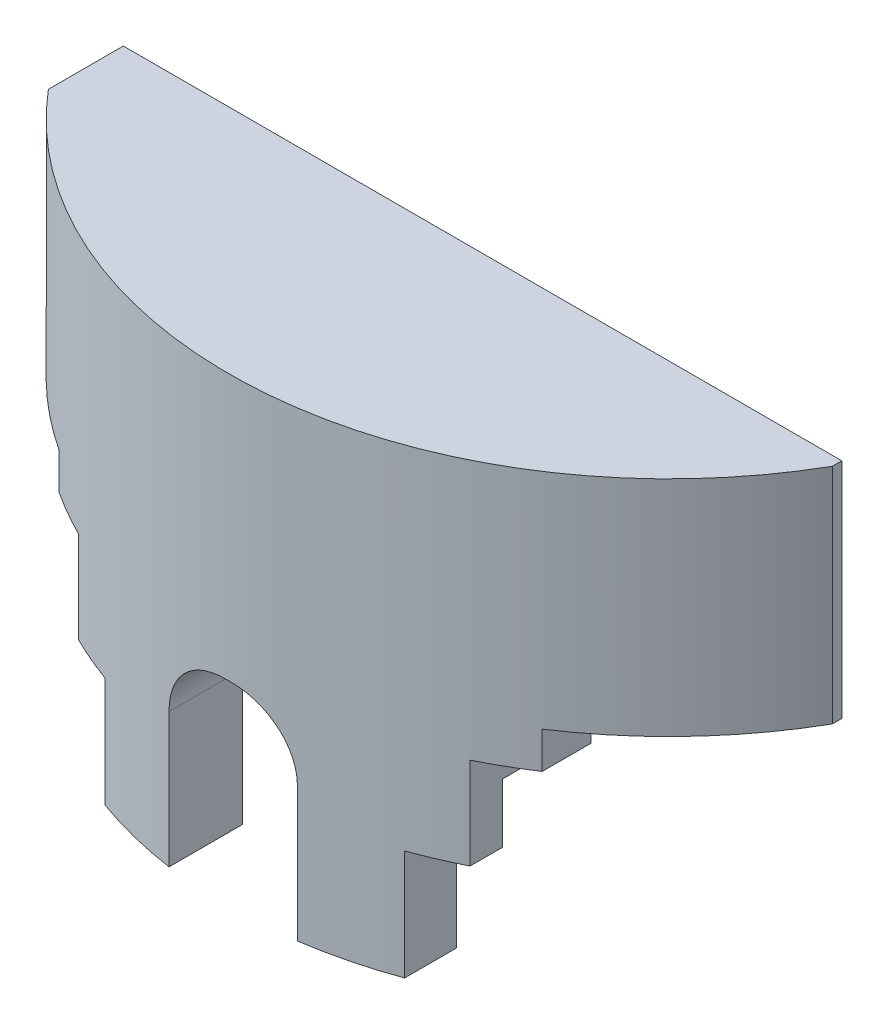
ISO-10303-21;
HEADER;
FILE_DESCRIPTION(('STEP AP214'),'2;1');
FILE_NAME('part.step','',(''),(''),'','','');
FILE_SCHEMA(('AUTOMOTIVE_DESIGN { 1 0 10303 214 1 1 1 1 }'));
ENDSEC;
DATA;
#1=APPLICATION_CONTEXT('core data for automotive mechanical design processes');
#2=APPLICATION_PROTOCOL_DEFINITION('international standard','automotive_design',2000,#1);
#3=PRODUCT_CONTEXT('',#1,'mechanical');
#4=PRODUCT('Part','Part','',(#3));
#5=PRODUCT_RELATED_PRODUCT_CATEGORY('part','',(#4));
#6=PRODUCT_DEFINITION_FORMATION('','',#4);
#7=PRODUCT_DEFINITION_CONTEXT('part definition',#1,'design');
#8=PRODUCT_DEFINITION('design','',#6,#7);
#9=PRODUCT_DEFINITION_SHAPE('','',#8);
#10=(LENGTH_UNIT() NAMED_UNIT(*) SI_UNIT(.MILLI.,.METRE.));
#11=(NAMED_UNIT(*) PLANE_ANGLE_UNIT() SI_UNIT($,.RADIAN.));
#12=(NAMED_UNIT(*) SI_UNIT($,.STERADIAN.) SOLID_ANGLE_UNIT());
#13=UNCERTAINTY_MEASURE_WITH_UNIT(LENGTH_MEASURE(1.E-05),#10,'distance_accuracy_value','');
#14=(GEOMETRIC_REPRESENTATION_CONTEXT(3) GLOBAL_UNCERTAINTY_ASSIGNED_CONTEXT((#13)) GLOBAL_UNIT_ASSIGNED_CONTEXT((#10,
#11,#12)) REPRESENTATION_CONTEXT('',''));
#15=CARTESIAN_POINT('',(0.,0.,0.));
#16=DIRECTION('',(0.,0.,1.));
#17=DIRECTION('',(1.,0.,0.));
#18=AXIS2_PLACEMENT_3D('',#15,#16,#17);
#19=CARTESIAN_POINT('',(0.,-42.5,0.));
#20=DIRECTION('',(0.,-1.,0.));
#21=DIRECTION('',(0.,0.,-1.));
#22=AXIS2_PLACEMENT_3D('',#19,#20,#21);
#23=PLANE('',#22);
#24=DIRECTION('',(0.,0.,1.));
#25=VECTOR('',#24,1.);
#26=CARTESIAN_POINT('',(32.,-42.5,34.2));
#27=LINE('',#26,#25);
#28=CARTESIAN_POINT('',(32.,-42.5,52.2));
#29=VERTEX_POINT('',#28);
#30=CARTESIAN_POINT('',(32.,-42.5,64.4980619863884));
#31=VERTEX_POINT('',#30);
#32=EDGE_CURVE('E382',#29,#31,#27,.T.);
#33=ORIENTED_EDGE('',*,*,#32,.F.);
#34=DIRECTION('',(1.,0.,0.));
#35=VECTOR('',#34,1.);
#36=CARTESIAN_POINT('',(0.,-42.5,52.2));
#37=LINE('',#36,#35);
#38=CARTESIAN_POINT('',(39.5,-42.5,52.2));
#39=VERTEX_POINT('',#38);
#40=EDGE_CURVE('E480',#29,#39,#37,.T.);
#41=ORIENTED_EDGE('',*,*,#40,.T.);
#42=DIRECTION('',(0.,0.,1.));
#43=VECTOR('',#42,1.);
#44=CARTESIAN_POINT('',(39.5,-42.5,0.));
#45=LINE('',#44,#43);
#46=CARTESIAN_POINT('',(39.5,-42.5,60.1975913139388));
#47=VERTEX_POINT('',#46);
#48=EDGE_CURVE('E371',#39,#47,#45,.T.);
#49=ORIENTED_EDGE('',*,*,#48,.T.);
#50=CARTESIAN_POINT('',(0.,-42.5,0.));
#51=DIRECTION('',(0.,-1.,0.));
#52=DIRECTION('',(0.,0.,-1.));
#53=AXIS2_PLACEMENT_3D('',#50,#51,#52);
#54=CIRCLE('',#53,72.);
#55=EDGE_CURVE('E360',#47,#31,#54,.T.);
#56=ORIENTED_EDGE('',*,*,#55,.T.);
#57=EDGE_LOOP('',(#33,#41,#49,#56));
#58=FACE_BOUND('',#57,.T.);
#59=ADVANCED_FACE('F36',(#58),#23,.T.);
#60=CARTESIAN_POINT('',(39.5,-42.5,0.));
#61=DIRECTION('',(-1.,0.,0.));
#62=DIRECTION('',(0.,0.,1.));
#63=AXIS2_PLACEMENT_3D('',#60,#61,#62);
#64=PLANE('',#63);
#65=ORIENTED_EDGE('',*,*,#48,.F.);
#66=DIRECTION('',(0.,-1.,0.));
#67=VECTOR('',#66,1.);
#68=CARTESIAN_POINT('',(39.5,-42.5,52.2));
#69=LINE('',#68,#67);
#70=CARTESIAN_POINT('',(39.5,-36.5,52.2));
#71=VERTEX_POINT('',#70);
#72=EDGE_CURVE('E452',#71,#39,#69,.T.);
#73=ORIENTED_EDGE('',*,*,#72,.F.);
#74=DIRECTION('',(0.,0.,1.));
#75=VECTOR('',#74,1.);
#76=CARTESIAN_POINT('',(39.5,-36.5,0.));
#77=LINE('',#76,#75);
#78=CARTESIAN_POINT('',(39.5,-36.5,60.1975913139388));
#79=VERTEX_POINT('',#78);
#80=EDGE_CURVE('E366',#71,#79,#77,.T.);
#81=ORIENTED_EDGE('',*,*,#80,.T.);
#82=DIRECTION('',(0.,1.,0.));
#83=VECTOR('',#82,1.);
#84=CARTESIAN_POINT('',(39.5,-42.5,60.1975913139388));
#85=LINE('',#84,#83);
#86=EDGE_CURVE('E252',#47,#79,#85,.T.);
#87=ORIENTED_EDGE('',*,*,#86,.F.);
#88=EDGE_LOOP('',(#65,#73,#81,#87));
#89=FACE_BOUND('',#88,.T.);
#90=ADVANCED_FACE('F325',(#89),#64,.F.);
#91=CARTESIAN_POINT('',(-39.5,-42.5,0.));
#92=DIRECTION('',(1.,0.,0.));
#93=DIRECTION('',(0.,0.,-1.));
#94=AXIS2_PLACEMENT_3D('',#91,#92,#93);
#95=PLANE('',#94);
#96=DIRECTION('',(0.,1.,0.));
#97=VECTOR('',#96,1.);
#98=CARTESIAN_POINT('',(-39.5,-42.5,52.2));
#99=LINE('',#98,#97);
#100=CARTESIAN_POINT('',(-39.5,-42.5,52.2));
#101=VERTEX_POINT('',#100);
#102=CARTESIAN_POINT('',(-39.5,-36.5,52.2));
#103=VERTEX_POINT('',#102);
#104=EDGE_CURVE('E456',#101,#103,#99,.T.);
#105=ORIENTED_EDGE('',*,*,#104,.F.);
#106=DIRECTION('',(0.,0.,-1.));
#107=VECTOR('',#106,1.);
#108=CARTESIAN_POINT('',(-39.5,-42.5,0.));
#109=LINE('',#108,#107);
#110=CARTESIAN_POINT('',(-39.5,-42.5,60.1975913139388));
#111=VERTEX_POINT('',#110);
#112=EDGE_CURVE('E351',#111,#101,#109,.T.);
#113=ORIENTED_EDGE('',*,*,#112,.F.);
#114=DIRECTION('',(0.,1.,0.));
#115=VECTOR('',#114,1.);
#116=CARTESIAN_POINT('',(-39.5,-42.5,60.1975913139388));
#117=LINE('',#116,#115);
#118=CARTESIAN_POINT('',(-39.5,-36.5,60.1975913139388));
#119=VERTEX_POINT('',#118);
#120=EDGE_CURVE('E359',#111,#119,#117,.T.);
#121=ORIENTED_EDGE('',*,*,#120,.T.);
#122=DIRECTION('',(0.,0.,-1.));
#123=VECTOR('',#122,1.);
#124=CARTESIAN_POINT('',(-39.5,-36.5,0.));
#125=LINE('',#124,#123);
#126=EDGE_CURVE('E368',#119,#103,#125,.T.);
#127=ORIENTED_EDGE('',*,*,#126,.T.);
#128=EDGE_LOOP('',(#105,#113,#121,#127));
#129=FACE_BOUND('',#128,.T.);
#130=ADVANCED_FACE('F332',(#129),#95,.F.);
#131=ORIENTED_EDGE('',*,*,#112,.T.);
#132=DIRECTION('',(1.,0.,0.));
#133=VECTOR('',#132,1.);
#134=CARTESIAN_POINT('',(0.,-42.5,52.2));
#135=LINE('',#134,#133);
#136=CARTESIAN_POINT('',(-32.,-42.5,52.2));
#137=VERTEX_POINT('',#136);
#138=EDGE_CURVE('E353',#101,#137,#135,.T.);
#139=ORIENTED_EDGE('',*,*,#138,.T.);
#140=DIRECTION('',(0.,0.,-1.));
#141=VECTOR('',#140,1.);
#142=CARTESIAN_POINT('',(-32.,-42.5,64.4980619863884));
#143=LINE('',#142,#141);
#144=CARTESIAN_POINT('',(-32.,-42.5,64.4980619863884));
#145=VERTEX_POINT('',#144);
#146=EDGE_CURVE('E385',#145,#137,#143,.T.);
#147=ORIENTED_EDGE('',*,*,#146,.F.);
#148=EDGE_CURVE('E356',#145,#111,#54,.T.);
#149=ORIENTED_EDGE('',*,*,#148,.T.);
#150=EDGE_LOOP('',(#131,#139,#147,#149));
#151=FACE_BOUND('',#150,.T.);
#152=ADVANCED_FACE('F328',(#151),#23,.T.);
#153=CARTESIAN_POINT('',(-32.,-57.5,64.4980619863884));
#154=DIRECTION('',(1.,0.,0.));
#155=DIRECTION('',(0.,0.,-1.));
#156=AXIS2_PLACEMENT_3D('',#153,#154,#155);
#157=PLANE('',#156);
#158=DIRECTION('',(0.,1.,0.));
#159=VECTOR('',#158,1.);
#160=CARTESIAN_POINT('',(-32.,-57.5,52.2));
#161=LINE('',#160,#159);
#162=CARTESIAN_POINT('',(-32.,-47.8210916541997,52.2));
#163=VERTEX_POINT('',#162);
#164=EDGE_CURVE('E483',#163,#137,#161,.T.);
#165=ORIENTED_EDGE('',*,*,#164,.F.);
#166=DIRECTION('',(0.,0.,-1.));
#167=VECTOR('',#166,1.);
#168=CARTESIAN_POINT('',(-32.,-47.8210916541997,59.2));
#169=LINE('',#168,#167);
#170=CARTESIAN_POINT('',(-32.,-47.8210916541997,59.2));
#171=VERTEX_POINT('',#170);
#172=EDGE_CURVE('E407',#163,#171,#169,.F.);
#173=ORIENTED_EDGE('',*,*,#172,.T.);
#174=DIRECTION('',(0.,1.,0.));
#175=VECTOR('',#174,1.);
#176=CARTESIAN_POINT('',(-32.,-57.5,59.2));
#177=LINE('',#176,#175);
#178=CARTESIAN_POINT('',(-32.,-57.5,59.2));
#179=VERTEX_POINT('',#178);
#180=EDGE_CURVE('E416',#179,#171,#177,.T.);
#181=ORIENTED_EDGE('',*,*,#180,.F.);
#182=DIRECTION('',(0.,0.,-1.));
#183=VECTOR('',#182,1.);
#184=CARTESIAN_POINT('',(-32.,-57.5,64.4980619863884));
#185=LINE('',#184,#183);
#186=CARTESIAN_POINT('',(-32.,-57.5,64.4980619863884));
#187=VERTEX_POINT('',#186);
#188=EDGE_CURVE('E389',#187,#179,#185,.T.);
#189=ORIENTED_EDGE('',*,*,#188,.F.);
#190=DIRECTION('',(0.,1.,0.));
#191=VECTOR('',#190,1.);
#192=CARTESIAN_POINT('',(-32.,-57.5,64.4980619863884));
#193=LINE('',#192,#191);
#194=EDGE_CURVE('E369',#187,#145,#193,.T.);
#195=ORIENTED_EDGE('',*,*,#194,.T.);
#196=ORIENTED_EDGE('',*,*,#146,.T.);
#197=EDGE_LOOP('',(#165,#173,#181,#189,#195,#196));
#198=FACE_BOUND('',#197,.T.);
#199=ADVANCED_FACE('F339',(#198),#157,.F.);
#200=CARTESIAN_POINT('',(32.,-57.5,34.2));
#201=DIRECTION('',(-1.,0.,0.));
#202=DIRECTION('',(0.,0.,1.));
#203=AXIS2_PLACEMENT_3D('',#200,#201,#202);
#204=PLANE('',#203);
#205=DIRECTION('',(0.,-1.,0.));
#206=VECTOR('',#205,1.);
#207=CARTESIAN_POINT('',(32.,-57.5,52.2));
#208=LINE('',#207,#206);
#209=CARTESIAN_POINT('',(32.,-47.8210916541997,52.2));
#210=VERTEX_POINT('',#209);
#211=EDGE_CURVE('E471',#29,#210,#208,.T.);
#212=ORIENTED_EDGE('',*,*,#211,.F.);
#213=ORIENTED_EDGE('',*,*,#32,.T.);
#214=DIRECTION('',(0.,1.,0.));
#215=VECTOR('',#214,1.);
#216=CARTESIAN_POINT('',(32.,-57.5,64.4980619863884));
#217=LINE('',#216,#215);
#218=CARTESIAN_POINT('',(32.,-57.5,64.4980619863884));
#219=VERTEX_POINT('',#218);
#220=EDGE_CURVE('E378',#219,#31,#217,.T.);
#221=ORIENTED_EDGE('',*,*,#220,.F.);
#222=DIRECTION('',(0.,0.,1.));
#223=VECTOR('',#222,1.);
#224=CARTESIAN_POINT('',(32.,-57.5,34.2));
#225=LINE('',#224,#223);
#226=CARTESIAN_POINT('',(32.,-57.5,59.2));
#227=VERTEX_POINT('',#226);
#228=EDGE_CURVE('E381',#227,#219,#225,.T.);
#229=ORIENTED_EDGE('',*,*,#228,.F.);
#230=DIRECTION('',(0.,-1.,0.));
#231=VECTOR('',#230,1.);
#232=CARTESIAN_POINT('',(32.,-57.5,59.2));
#233=LINE('',#232,#231);
#234=CARTESIAN_POINT('',(32.,-47.8210916541997,59.2));
#235=VERTEX_POINT('',#234);
#236=EDGE_CURVE('E422',#235,#227,#233,.T.);
#237=ORIENTED_EDGE('',*,*,#236,.F.);
#238=DIRECTION('',(0.,0.,-1.));
#239=VECTOR('',#238,1.);
#240=CARTESIAN_POINT('',(32.,-47.8210916541997,59.2));
#241=LINE('',#240,#239);
#242=EDGE_CURVE('E270',#235,#210,#241,.T.);
#243=ORIENTED_EDGE('',*,*,#242,.T.);
#244=EDGE_LOOP('',(#212,#213,#221,#229,#237,#243));
#245=FACE_BOUND('',#244,.T.);
#246=ADVANCED_FACE('F345',(#245),#204,.F.);
#247=CARTESIAN_POINT('',(0.,-53.5,59.2));
#248=DIRECTION('',(0.,0.,-1.));
#249=DIRECTION('',(-1.,0.,0.));
#250=AXIS2_PLACEMENT_3D('',#247,#248,#249);
#251=CYLINDRICAL_SURFACE('',#250,32.5);
#252=CARTESIAN_POINT('',(0.,-53.5,52.2));
#253=DIRECTION('',(0.,0.,-1.));
#254=DIRECTION('',(-1.,0.,0.));
#255=AXIS2_PLACEMENT_3D('',#252,#253,#254);
#256=CIRCLE('',#255,32.5);
#257=EDGE_CURVE('E45',#210,#163,#256,.F.);
#258=ORIENTED_EDGE('',*,*,#257,.F.);
#259=ORIENTED_EDGE('',*,*,#242,.F.);
#260=CARTESIAN_POINT('',(0.,-53.5,59.2));
#261=DIRECTION('',(0.,0.,-1.));
#262=DIRECTION('',(-1.,0.,0.));
#263=AXIS2_PLACEMENT_3D('',#260,#261,#262);
#264=CIRCLE('',#263,32.5);
#265=EDGE_CURVE('E431',#171,#235,#264,.T.);
#266=ORIENTED_EDGE('',*,*,#265,.F.);
#267=ORIENTED_EDGE('',*,*,#172,.F.);
#268=EDGE_LOOP('',(#258,#259,#266,#267));
#269=FACE_BOUND('',#268,.T.);
#270=ADVANCED_FACE('F492',(#269),#251,.F.);
#271=CARTESIAN_POINT('',(0.,-75.5,0.));
#272=DIRECTION('',(0.,1.,0.));
#273=DIRECTION('',(0.,0.,1.));
#274=AXIS2_PLACEMENT_3D('',#271,#272,#273);
#275=PLANE('',#274);
#276=DIRECTION('',(-1.,0.,0.));
#277=VECTOR('',#276,1.);
#278=CARTESIAN_POINT('',(0.,-75.5,59.2));
#279=LINE('',#278,#277);
#280=CARTESIAN_POINT('',(-10.5,-75.5,59.2));
#281=VERTEX_POINT('',#280);
#282=CARTESIAN_POINT('',(-24.5,-75.5,59.2));
#283=VERTEX_POINT('',#282);
#284=EDGE_CURVE('E264',#281,#283,#279,.T.);
#285=ORIENTED_EDGE('',*,*,#284,.F.);
#286=DIRECTION('',(0.,0.,-1.));
#287=VECTOR('',#286,1.);
#288=CARTESIAN_POINT('',(-10.5,-75.5,34.2));
#289=LINE('',#288,#287);
#290=CARTESIAN_POINT('',(-10.5,-75.5,71.2302604235026));
#291=VERTEX_POINT('',#290);
#292=EDGE_CURVE('E443',#291,#281,#289,.T.);
#293=ORIENTED_EDGE('',*,*,#292,.F.);
#294=CARTESIAN_POINT('',(0.,-75.5,0.));
#295=DIRECTION('',(0.,-1.,0.));
#296=DIRECTION('',(0.,0.,1.));
#297=AXIS2_PLACEMENT_3D('',#294,#295,#296);
#298=CIRCLE('',#297,72.);
#299=CARTESIAN_POINT('',(-24.5,-75.5,67.7033972559723));
#300=VERTEX_POINT('',#299);
#301=EDGE_CURVE('E413',#291,#300,#298,.T.);
#302=ORIENTED_EDGE('',*,*,#301,.T.);
#303=DIRECTION('',(0.,0.,-1.));
#304=VECTOR('',#303,1.);
#305=CARTESIAN_POINT('',(-24.5,-75.5,34.2));
#306=LINE('',#305,#304);
#307=EDGE_CURVE('E400',#300,#283,#306,.T.);
#308=ORIENTED_EDGE('',*,*,#307,.T.);
#309=EDGE_LOOP('',(#285,#293,#302,#308));
#310=FACE_BOUND('',#309,.T.);
#311=ADVANCED_FACE('F541',(#310),#275,.F.);
#312=CARTESIAN_POINT('',(0.,-57.5,0.));
#313=DIRECTION('',(0.,-1.,0.));
#314=DIRECTION('',(0.,0.,-1.));
#315=AXIS2_PLACEMENT_3D('',#312,#313,#314);
#316=PLANE('',#315);
#317=ORIENTED_EDGE('',*,*,#188,.T.);
#318=DIRECTION('',(1.,0.,0.));
#319=VECTOR('',#318,1.);
#320=CARTESIAN_POINT('',(0.,-57.5,59.2));
#321=LINE('',#320,#319);
#322=CARTESIAN_POINT('',(-24.5,-57.5,59.2));
#323=VERTEX_POINT('',#322);
#324=EDGE_CURVE('E419',#179,#323,#321,.T.);
#325=ORIENTED_EDGE('',*,*,#324,.T.);
#326=DIRECTION('',(0.,0.,-1.));
#327=VECTOR('',#326,1.);
#328=CARTESIAN_POINT('',(-24.5,-57.5,34.2));
#329=LINE('',#328,#327);
#330=CARTESIAN_POINT('',(-24.5,-57.5,67.7033972559723));
#331=VERTEX_POINT('',#330);
#332=EDGE_CURVE('E401',#331,#323,#329,.T.);
#333=ORIENTED_EDGE('',*,*,#332,.F.);
#334=CARTESIAN_POINT('',(0.,-57.5,0.));
#335=DIRECTION('',(0.,-1.,0.));
#336=DIRECTION('',(0.,0.,-1.));
#337=AXIS2_PLACEMENT_3D('',#334,#335,#336);
#338=CIRCLE('',#337,72.);
#339=EDGE_CURVE('E384',#331,#187,#338,.T.);
#340=ORIENTED_EDGE('',*,*,#339,.T.);
#341=EDGE_LOOP('',(#317,#325,#333,#340));
#342=FACE_BOUND('',#341,.T.);
#343=ADVANCED_FACE('F550',(#342),#316,.T.);
#344=DIRECTION('',(0.,0.,1.));
#345=VECTOR('',#344,1.);
#346=CARTESIAN_POINT('',(24.5,-57.5,34.2));
#347=LINE('',#346,#345);
#348=CARTESIAN_POINT('',(24.5,-57.5,59.2));
#349=VERTEX_POINT('',#348);
#350=CARTESIAN_POINT('',(24.5,-57.5,67.7033972559723));
#351=VERTEX_POINT('',#350);
#352=EDGE_CURVE('E405',#349,#351,#347,.T.);
#353=ORIENTED_EDGE('',*,*,#352,.F.);
#354=DIRECTION('',(1.,0.,0.));
#355=VECTOR('',#354,1.);
#356=CARTESIAN_POINT('',(0.,-57.5,59.2));
#357=LINE('',#356,#355);
#358=EDGE_CURVE('E424',#349,#227,#357,.T.);
#359=ORIENTED_EDGE('',*,*,#358,.T.);
#360=ORIENTED_EDGE('',*,*,#228,.T.);
#361=EDGE_CURVE('E392',#219,#351,#338,.T.);
#362=ORIENTED_EDGE('',*,*,#361,.T.);
#363=EDGE_LOOP('',(#353,#359,#360,#362));
#364=FACE_BOUND('',#363,.T.);
#365=ADVANCED_FACE('F504',(#364),#316,.T.);
#366=CARTESIAN_POINT('',(24.5,-75.5,34.2));
#367=DIRECTION('',(-1.,0.,0.));
#368=DIRECTION('',(0.,0.,1.));
#369=AXIS2_PLACEMENT_3D('',#366,#367,#368);
#370=PLANE('',#369);
#371=DIRECTION('',(0.,-1.,0.));
#372=VECTOR('',#371,1.);
#373=CARTESIAN_POINT('',(24.5,-75.5,59.2));
#374=LINE('',#373,#372);
#375=CARTESIAN_POINT('',(24.5,-75.5,59.2));
#376=VERTEX_POINT('',#375);
#377=EDGE_CURVE('E427',#349,#376,#374,.T.);
#378=ORIENTED_EDGE('',*,*,#377,.F.);
#379=ORIENTED_EDGE('',*,*,#352,.T.);
#380=DIRECTION('',(0.,1.,0.));
#381=VECTOR('',#380,1.);
#382=CARTESIAN_POINT('',(24.5,-75.5,67.7033972559723));
#383=LINE('',#382,#381);
#384=CARTESIAN_POINT('',(24.5,-75.5,67.7033972559723));
#385=VERTEX_POINT('',#384);
#386=EDGE_CURVE('E387',#385,#351,#383,.T.);
#387=ORIENTED_EDGE('',*,*,#386,.F.);
#388=DIRECTION('',(0.,0.,1.));
#389=VECTOR('',#388,1.);
#390=CARTESIAN_POINT('',(24.5,-75.5,34.2));
#391=LINE('',#390,#389);
#392=EDGE_CURVE('E404',#376,#385,#391,.T.);
#393=ORIENTED_EDGE('',*,*,#392,.F.);
#394=EDGE_LOOP('',(#378,#379,#387,#393));
#395=FACE_BOUND('',#394,.T.);
#396=ADVANCED_FACE('F509',(#395),#370,.F.);
#397=CARTESIAN_POINT('',(-24.5,-75.5,34.2));
#398=DIRECTION('',(1.,0.,0.));
#399=DIRECTION('',(0.,0.,-1.));
#400=AXIS2_PLACEMENT_3D('',#397,#398,#399);
#401=PLANE('',#400);
#402=DIRECTION('',(0.,1.,0.));
#403=VECTOR('',#402,1.);
#404=CARTESIAN_POINT('',(-24.5,-75.5,59.2));
#405=LINE('',#404,#403);
#406=EDGE_CURVE('E429',#283,#323,#405,.T.);
#407=ORIENTED_EDGE('',*,*,#406,.F.);
#408=ORIENTED_EDGE('',*,*,#307,.F.);
#409=DIRECTION('',(0.,1.,0.));
#410=VECTOR('',#409,1.);
#411=CARTESIAN_POINT('',(-24.5,-75.5,67.7033972559723));
#412=LINE('',#411,#410);
#413=EDGE_CURVE('E397',#300,#331,#412,.T.);
#414=ORIENTED_EDGE('',*,*,#413,.T.);
#415=ORIENTED_EDGE('',*,*,#332,.T.);
#416=EDGE_LOOP('',(#407,#408,#414,#415));
#417=FACE_BOUND('',#416,.T.);
#418=ADVANCED_FACE('F544',(#417),#401,.F.);
#419=CARTESIAN_POINT('',(10.5,-75.5,71.2302604235026));
#420=VERTEX_POINT('',#419);
#421=EDGE_CURVE('E410',#385,#420,#298,.T.);
#422=ORIENTED_EDGE('',*,*,#421,.T.);
#423=DIRECTION('',(0.,0.,1.));
#424=VECTOR('',#423,1.);
#425=CARTESIAN_POINT('',(10.5,-75.5,34.2));
#426=LINE('',#425,#424);
#427=CARTESIAN_POINT('',(10.5,-75.5,59.2));
#428=VERTEX_POINT('',#427);
#429=EDGE_CURVE('E441',#428,#420,#426,.T.);
#430=ORIENTED_EDGE('',*,*,#429,.F.);
#431=EDGE_CURVE('E267',#376,#428,#279,.T.);
#432=ORIENTED_EDGE('',*,*,#431,.F.);
#433=ORIENTED_EDGE('',*,*,#392,.T.);
#434=EDGE_LOOP('',(#422,#430,#432,#433));
#435=FACE_BOUND('',#434,.T.);
#436=ADVANCED_FACE('F513',(#435),#275,.F.);
#437=CARTESIAN_POINT('',(0.,-36.5,0.));
#438=DIRECTION('',(0.,1.,0.));
#439=DIRECTION('',(0.,0.,1.));
#440=AXIS2_PLACEMENT_3D('',#437,#438,#439);
#441=PLANE('',#440);
#442=CARTESIAN_POINT('',(0.,-36.5,0.));
#443=DIRECTION('',(0.,1.,0.));
#444=DIRECTION('',(0.,0.,1.));
#445=AXIS2_PLACEMENT_3D('',#442,#443,#444);
#446=CIRCLE('',#445,72.);
#447=CARTESIAN_POINT('',(-55.,-36.5,46.4650406219558));
#448=VERTEX_POINT('',#447);
#449=EDGE_CURVE('E236',#448,#119,#446,.T.);
#450=ORIENTED_EDGE('',*,*,#449,.F.);
#451=DIRECTION('',(0.,0.,-1.));
#452=VECTOR('',#451,1.);
#453=CARTESIAN_POINT('',(-55.,-36.5,72.));
#454=LINE('',#453,#452);
#455=CARTESIAN_POINT('',(-55.,-36.5,34.2));
#456=VERTEX_POINT('',#455);
#457=EDGE_CURVE('E223',#448,#456,#454,.T.);
#458=ORIENTED_EDGE('',*,*,#457,.T.);
#459=DIRECTION('',(-1.,0.,0.));
#460=VECTOR('',#459,1.);
#461=CARTESIAN_POINT('',(-62.5,-36.5,34.2));
#462=LINE('',#461,#460);
#463=CARTESIAN_POINT('',(-40.7749773139559,-36.5,34.2));
#464=VERTEX_POINT('',#463);
#465=EDGE_CURVE('E234',#464,#456,#462,.T.);
#466=ORIENTED_EDGE('',*,*,#465,.F.);
#467=DIRECTION('',(0.,0.,-1.));
#468=VECTOR('',#467,1.);
#469=CARTESIAN_POINT('',(-40.7749773139559,-36.5,52.2));
#470=LINE('',#469,#468);
#471=CARTESIAN_POINT('',(-40.7749773139559,-36.5,52.2));
#472=VERTEX_POINT('',#471);
#473=EDGE_CURVE('E448',#464,#472,#470,.F.);
#474=ORIENTED_EDGE('',*,*,#473,.T.);
#475=DIRECTION('',(-1.,0.,0.));
#476=VECTOR('',#475,1.);
#477=CARTESIAN_POINT('',(0.,-36.5,52.2));
#478=LINE('',#477,#476);
#479=EDGE_CURVE('E454',#103,#472,#478,.T.);
#480=ORIENTED_EDGE('',*,*,#479,.F.);
#481=ORIENTED_EDGE('',*,*,#126,.F.);
#482=EDGE_LOOP('',(#450,#458,#466,#474,#480,#481));
#483=FACE_BOUND('',#482,.T.);
#484=ADVANCED_FACE('F232',(#483),#441,.F.);
#485=DIRECTION('',(-1.,0.,0.));
#486=VECTOR('',#485,1.);
#487=CARTESIAN_POINT('',(0.,-36.5,52.2));
#488=LINE('',#487,#486);
#489=CARTESIAN_POINT('',(40.7749773139559,-36.5,52.2));
#490=VERTEX_POINT('',#489);
#491=EDGE_CURVE('E450',#490,#71,#488,.T.);
#492=ORIENTED_EDGE('',*,*,#491,.F.);
#493=DIRECTION('',(0.,0.,-1.));
#494=VECTOR('',#493,1.);
#495=CARTESIAN_POINT('',(40.7749773139559,-36.5,52.2));
#496=LINE('',#495,#494);
#497=CARTESIAN_POINT('',(40.7749773139559,-36.5,34.2));
#498=VERTEX_POINT('',#497);
#499=EDGE_CURVE('E445',#490,#498,#496,.T.);
#500=ORIENTED_EDGE('',*,*,#499,.T.);
#501=CARTESIAN_POINT('',(62.5,-36.5,34.2));
#502=VERTEX_POINT('',#501);
#503=EDGE_CURVE('E242',#502,#498,#462,.T.);
#504=ORIENTED_EDGE('',*,*,#503,.F.);
#505=DIRECTION('',(0.,0.,-1.));
#506=VECTOR('',#505,1.);
#507=CARTESIAN_POINT('',(62.5,-36.5,34.2));
#508=LINE('',#507,#506);
#509=CARTESIAN_POINT('',(62.5,-36.5,35.7456291034302));
#510=VERTEX_POINT('',#509);
#511=EDGE_CURVE('E255',#510,#502,#508,.T.);
#512=ORIENTED_EDGE('',*,*,#511,.F.);
#513=EDGE_CURVE('E246',#79,#510,#446,.T.);
#514=ORIENTED_EDGE('',*,*,#513,.F.);
#515=ORIENTED_EDGE('',*,*,#80,.F.);
#516=EDGE_LOOP('',(#492,#500,#504,#512,#514,#515));
#517=FACE_BOUND('',#516,.T.);
#518=ADVANCED_FACE('F316',(#517),#441,.F.);
#519=CARTESIAN_POINT('',(-62.5,-36.5,34.2));
#520=DIRECTION('',(0.,0.,-1.));
#521=DIRECTION('',(-1.,0.,0.));
#522=AXIS2_PLACEMENT_3D('',#519,#520,#521);
#523=PLANE('',#522);
#524=DIRECTION('',(0.,-1.,0.));
#525=VECTOR('',#524,1.);
#526=CARTESIAN_POINT('',(-55.,0.,34.2));
#527=LINE('',#526,#525);
#528=CARTESIAN_POINT('',(-55.,0.,34.2));
#529=VERTEX_POINT('',#528);
#530=EDGE_CURVE('E220',#529,#456,#527,.T.);
#531=ORIENTED_EDGE('',*,*,#530,.F.);
#532=DIRECTION('',(-1.,0.,0.));
#533=VECTOR('',#532,1.);
#534=CARTESIAN_POINT('',(-62.5,0.,34.2));
#535=LINE('',#534,#533);
#536=CARTESIAN_POINT('',(62.5,0.,34.2));
#537=VERTEX_POINT('',#536);
#538=EDGE_CURVE('E259',#537,#529,#535,.T.);
#539=ORIENTED_EDGE('',*,*,#538,.F.);
#540=DIRECTION('',(0.,1.,0.));
#541=VECTOR('',#540,1.);
#542=CARTESIAN_POINT('',(62.5,-36.5,34.2));
#543=LINE('',#542,#541);
#544=EDGE_CURVE('E262',#502,#537,#543,.T.);
#545=ORIENTED_EDGE('',*,*,#544,.F.);
#546=ORIENTED_EDGE('',*,*,#503,.T.);
#547=CARTESIAN_POINT('',(27.,-22.,34.2));
#548=DIRECTION('',(0.,0.,-1.));
#549=DIRECTION('',(-1.,0.,0.));
#550=AXIS2_PLACEMENT_3D('',#547,#548,#549);
#551=CIRCLE('',#550,20.);
#552=CARTESIAN_POINT('',(27.,-2.,34.2));
#553=VERTEX_POINT('',#552);
#554=EDGE_CURVE('E469',#553,#498,#551,.T.);
#555=ORIENTED_EDGE('',*,*,#554,.F.);
#556=DIRECTION('',(1.,0.,0.));
#557=VECTOR('',#556,1.);
#558=CARTESIAN_POINT('',(27.,-2.,34.2));
#559=LINE('',#558,#557);
#560=CARTESIAN_POINT('',(-27.,-2.,34.2));
#561=VERTEX_POINT('',#560);
#562=EDGE_CURVE('E464',#561,#553,#559,.T.);
#563=ORIENTED_EDGE('',*,*,#562,.F.);
#564=CARTESIAN_POINT('',(-27.,-22.,34.2));
#565=DIRECTION('',(0.,0.,-1.));
#566=DIRECTION('',(-1.,0.,0.));
#567=AXIS2_PLACEMENT_3D('',#564,#565,#566);
#568=CIRCLE('',#567,20.);
#569=EDGE_CURVE('E241',#464,#561,#568,.T.);
#570=ORIENTED_EDGE('',*,*,#569,.F.);
#571=ORIENTED_EDGE('',*,*,#465,.T.);
#572=EDGE_LOOP('',(#531,#539,#545,#546,#555,#563,#570,#571));
#573=FACE_BOUND('',#572,.T.);
#574=ADVANCED_FACE('F239',(#573),#523,.T.);
#575=CARTESIAN_POINT('',(62.5,-36.5,34.2));
#576=DIRECTION('',(1.,0.,0.));
#577=DIRECTION('',(0.,0.,-1.));
#578=AXIS2_PLACEMENT_3D('',#575,#576,#577);
#579=PLANE('',#578);
#580=DIRECTION('',(0.,0.,-1.));
#581=VECTOR('',#580,1.);
#582=CARTESIAN_POINT('',(62.5,0.,34.2));
#583=LINE('',#582,#581);
#584=CARTESIAN_POINT('',(62.5,0.,35.7456291034302));
#585=VERTEX_POINT('',#584);
#586=EDGE_CURVE('E243',#585,#537,#583,.T.);
#587=ORIENTED_EDGE('',*,*,#586,.F.);
#588=DIRECTION('',(0.,1.,0.));
#589=VECTOR('',#588,1.);
#590=CARTESIAN_POINT('',(62.5,-36.5,35.7456291034302));
#591=LINE('',#590,#589);
#592=EDGE_CURVE('E258',#510,#585,#591,.T.);
#593=ORIENTED_EDGE('',*,*,#592,.F.);
#594=ORIENTED_EDGE('',*,*,#511,.T.);
#595=ORIENTED_EDGE('',*,*,#544,.T.);
#596=EDGE_LOOP('',(#587,#593,#594,#595));
#597=FACE_BOUND('',#596,.T.);
#598=ADVANCED_FACE('F311',(#597),#579,.T.);
#599=CARTESIAN_POINT('',(0.,-36.5,0.));
#600=DIRECTION('',(0.,1.,0.));
#601=DIRECTION('',(0.,0.,1.));
#602=AXIS2_PLACEMENT_3D('',#599,#600,#601);
#603=CYLINDRICAL_SURFACE('',#602,72.);
#604=DIRECTION('',(0.,1.,0.));
#605=VECTOR('',#604,1.);
#606=CARTESIAN_POINT('',(-55.,-36.5,46.4650406219558));
#607=LINE('',#606,#605);
#608=CARTESIAN_POINT('',(-55.,0.,46.4650406219558));
#609=VERTEX_POINT('',#608);
#610=EDGE_CURVE('E51',#448,#609,#607,.T.);
#611=ORIENTED_EDGE('',*,*,#610,.F.);
#612=ORIENTED_EDGE('',*,*,#449,.T.);
#613=ORIENTED_EDGE('',*,*,#120,.F.);
#614=ORIENTED_EDGE('',*,*,#148,.F.);
#615=ORIENTED_EDGE('',*,*,#194,.F.);
#616=ORIENTED_EDGE('',*,*,#339,.F.);
#617=ORIENTED_EDGE('',*,*,#413,.F.);
#618=ORIENTED_EDGE('',*,*,#301,.F.);
#619=DIRECTION('',(0.,1.,0.));
#620=VECTOR('',#619,1.);
#621=CARTESIAN_POINT('',(-10.5,-36.5,71.2302604235026));
#622=LINE('',#621,#620);
#623=CARTESIAN_POINT('',(-10.5,-53.5,71.2302604235026));
#624=VERTEX_POINT('',#623);
#625=EDGE_CURVE('E434',#624,#291,#622,.F.);
#626=ORIENTED_EDGE('',*,*,#625,.F.);
#627=CARTESIAN_POINT('',(-10.5,-53.5,71.2302604235026));
#628=CARTESIAN_POINT('',(-10.5000318896068,-53.2203562502942,71.2302432221756));
#629=CARTESIAN_POINT('',(-10.4882712756268,-52.9407190356558,71.2319889612127));
#630=CARTESIAN_POINT('',(-10.4413968735752,-52.3834744441433,71.2388817151814));
#631=CARTESIAN_POINT('',(-10.4062851157693,-52.1058668929214,71.2440284344145));
#632=CARTESIAN_POINT('',(-10.3129957328335,-51.5549771039073,71.2575905087987));
#633=CARTESIAN_POINT('',(-10.2548456097689,-51.2816901114853,71.2660019664235));
#634=CARTESIAN_POINT('',(-10.1159263531867,-50.7410422084241,71.2858540357494));
#635=CARTESIAN_POINT('',(-10.035157308626,-50.4736812744832,71.2972946355373));
#636=CARTESIAN_POINT('',(-9.85157117391986,-49.9466920465393,71.322893382333));
#637=CARTESIAN_POINT('',(-9.74874799461759,-49.6870659107104,71.3370522797507));
#638=CARTESIAN_POINT('',(-9.52181553738207,-49.1774249950024,71.3676966993025));
#639=CARTESIAN_POINT('',(-9.39770564526705,-48.9274104927009,71.3841822885659));
#640=CARTESIAN_POINT('',(-9.1290984342827,-48.4387357219678,71.4190303174495));
#641=CARTESIAN_POINT('',(-8.98460191016969,-48.2000750114026,71.4373926838974));
#642=CARTESIAN_POINT('',(-8.6762393650125,-47.7357319315694,71.4754992658996));
#643=CARTESIAN_POINT('',(-8.51237333344282,-47.5100495693539,71.4952434822047));
#644=CARTESIAN_POINT('',(-8.16527171992235,-47.0717601864053,71.5357187485123));
#645=CARTESIAN_POINT('',(-7.98191562533108,-46.8592491179221,71.5564554436065));
#646=CARTESIAN_POINT('',(-7.59801232523807,-46.4504002307535,71.5982365684368));
#647=CARTESIAN_POINT('',(-7.39746504846413,-46.2540624791271,71.6192809994484));
#648=CARTESIAN_POINT('',(-6.98052578952238,-45.8788812842905,71.6611202407874));
#649=CARTESIAN_POINT('',(-6.76413061363192,-45.7000413843637,71.6819149998117));
#650=CARTESIAN_POINT('',(-6.31702918332705,-45.3611513214773,71.7226987975393));
#651=CARTESIAN_POINT('',(-6.08632311907676,-45.2011009089234,71.742687846943));
#652=CARTESIAN_POINT('',(-5.61094837467386,-44.9001303575886,71.7814350070208));
#653=CARTESIAN_POINT('',(-5.36621293796585,-44.7593147246447,71.8001861278204));
#654=CARTESIAN_POINT('',(-4.86561400473583,-44.4988316151596,71.8358459721319));
#655=CARTESIAN_POINT('',(-4.60975070369934,-44.3791637672976,71.8527547279906));
#656=CARTESIAN_POINT('',(-4.08881830781539,-44.1619078993171,71.8842791123103));
#657=CARTESIAN_POINT('',(-3.82375393657339,-44.0643087375295,71.8988958967556));
#658=CARTESIAN_POINT('',(-3.28630588925391,-43.8918689333685,71.9254659104105));
#659=CARTESIAN_POINT('',(-3.01392400046756,-43.8170227876363,71.9374197835213));
#660=CARTESIAN_POINT('',(-2.37192200978974,-43.669568979104,71.9618536471884));
#661=CARTESIAN_POINT('',(-2.00011779527075,-43.6060014291924,71.9731839835814));
#662=CARTESIAN_POINT('',(-1.43918488788613,-43.5424209501828,71.9858586131107));
#663=CARTESIAN_POINT('',(-1.25175569149256,-43.526522617226,71.9893627292551));
#664=CARTESIAN_POINT('',(-0.87623592165015,-43.5053118458653,71.9949129806392));
#665=CARTESIAN_POINT('',(-0.688145210481235,-43.5000017607252,71.9969587917021));
#666=CARTESIAN_POINT('',(-0.500000000000001,-43.5,71.9982638679572));
#667=B_SPLINE_CURVE_WITH_KNOTS('',3,(#627,#628,#629,#630,#631,#632,#633,#634,#635,#636,#637,
#638,#639,#640,#641,#642,#643,#644,#645,#646,#647,#648,#649,#650,#651,#652,#653,#654,#655,#656,
#657,#658,#659,#660,#661,#662,#663,#664,#665,#666),.UNSPECIFIED.,.F.,.F.,(4,2,2,2,2,2,2,2,2,2,2,
2,2,2,2,2,2,2,2,4),(0.,0.838668984149888,1.67726505973973,2.51486306250061,3.352457771161,
4.19028403848825,5.02813448353722,5.86595227468688,6.70377052111404,7.54710919596734,
8.39045136735239,9.23396396208348,10.0774653505585,10.9253813594243,11.7732824787841,
12.6207545634395,13.4680215033949,14.5973483535101,15.1614974988911,15.7257720138311),.UNSPECIFIED.);
#668=CARTESIAN_POINT('',(-0.5,-43.5,71.9982638679572));
#669=VERTEX_POINT('',#668);
#670=EDGE_CURVE('E292',#624,#669,#667,.T.);
#671=ORIENTED_EDGE('',*,*,#670,.T.);
#672=CARTESIAN_POINT('',(0.,-43.5,0.));
#673=DIRECTION('',(0.,1.,0.));
#674=DIRECTION('',(0.,0.,1.));
#675=AXIS2_PLACEMENT_3D('',#672,#673,#674);
#676=CIRCLE('',#675,72.);
#677=CARTESIAN_POINT('',(0.5,-43.5,71.9982638679572));
#678=VERTEX_POINT('',#677);
#679=EDGE_CURVE('E438',#678,#669,#676,.F.);
#680=ORIENTED_EDGE('',*,*,#679,.F.);
#681=CARTESIAN_POINT('',(0.5,-43.5,71.9982638679572));
#682=CARTESIAN_POINT('',(0.78000762336906,-43.4999683184682,71.9963356849737));
#683=CARTESIAN_POINT('',(1.05999686224921,-43.5117592701079,71.9927419325381));
#684=CARTESIAN_POINT('',(1.6179208917887,-43.5587502185692,71.9823557636049));
#685=CARTESIAN_POINT('',(1.89585585855376,-43.5939481846911,71.9755636246015));
#686=CARTESIAN_POINT('',(2.44738274096362,-43.6874627262184,71.9589224382079));
#687=CARTESIAN_POINT('',(2.72097932219829,-43.7457524263869,71.9490769473335));
#688=CARTESIAN_POINT('',(3.26222035854874,-43.8850007905836,71.9265683912101));
#689=CARTESIAN_POINT('',(3.52986483529543,-43.9659593722147,71.9139053362026));
#690=CARTESIAN_POINT('',(4.05739469162397,-44.1499729533355,71.8860720382307));
#691=CARTESIAN_POINT('',(4.31727789362795,-44.2530340889937,71.8709010992897));
#692=CARTESIAN_POINT('',(4.82740413965042,-44.4804896614158,71.8384402481452));
#693=CARTESIAN_POINT('',(5.07764691072875,-44.6048847016428,71.8211502760054));
#694=CARTESIAN_POINT('',(5.56674544073701,-44.8741080164946,71.7848973385267));
#695=CARTESIAN_POINT('',(5.80560169923566,-45.0189353935706,71.7659344466892));
#696=CARTESIAN_POINT('',(6.27030023510635,-45.3280049373824,71.7268270169915));
#697=CARTESIAN_POINT('',(6.49614250902219,-45.4922471092743,71.7066824788175));
#698=CARTESIAN_POINT('',(6.93463494366949,-45.8400863464751,71.6656098897417));
#699=CARTESIAN_POINT('',(7.14719402240184,-46.0237977581085,71.6446777351158));
#700=CARTESIAN_POINT('',(7.55610271665037,-46.4084413129949,71.6027064120668));
#701=CARTESIAN_POINT('',(7.75245228095064,-46.6093735106548,71.5816672433057));
#702=CARTESIAN_POINT('',(8.12761493014117,-47.0271089959514,71.5400413319408));
#703=CARTESIAN_POINT('',(8.30642450899062,-47.243915441603,71.5194546804254));
#704=CARTESIAN_POINT('',(8.64520616785713,-47.6918614690535,71.4792943259795));
#705=CARTESIAN_POINT('',(8.80517851699022,-47.9230008460145,71.4597206085801));
#706=CARTESIAN_POINT('',(9.1057672006953,-48.3989882799762,71.4220417824793));
#707=CARTESIAN_POINT('',(9.24630168602142,-48.6438885430235,71.4039430083792));
#708=CARTESIAN_POINT('',(9.50621222082561,-49.1448004760687,71.3698053566074));
#709=CARTESIAN_POINT('',(9.62558866998482,-49.4008119360592,71.3537664400261));
#710=CARTESIAN_POINT('',(9.84224921381293,-49.9220164531871,71.3242041374778));
#711=CARTESIAN_POINT('',(9.93954469777625,-50.187204695244,71.3106794553306));
#712=CARTESIAN_POINT('',(10.1113660517012,-50.7248728682245,71.2865188977067));
#713=CARTESIAN_POINT('',(10.1858974960227,-50.9973509962291,71.2758823150755));
#714=CARTESIAN_POINT('',(10.332178056786,-51.6376611992078,71.254848016763));
#715=CARTESIAN_POINT('',(10.3950941440143,-52.0076126255968,71.245659295417));
#716=CARTESIAN_POINT('',(10.4580195650263,-52.5656928251377,71.2364387073505));
#717=CARTESIAN_POINT('',(10.4737532361598,-52.7521585663945,71.2341256102321));
#718=CARTESIAN_POINT('',(10.4947437843691,-53.1257332703134,71.2310355088365));
#719=CARTESIAN_POINT('',(10.4999983235139,-53.312842367185,71.2302588473437));
#720=CARTESIAN_POINT('',(10.5,-53.5,71.2302604235026));
#721=B_SPLINE_CURVE_WITH_KNOTS('',3,(#681,#682,#683,#684,#685,#686,#687,#688,#689,#690,#691,
#692,#693,#694,#695,#696,#697,#698,#699,#700,#701,#702,#703,#704,#705,#706,#707,#708,#709,#710,
#711,#712,#713,#714,#715,#716,#717,#718,#719,#720),.UNSPECIFIED.,.F.,.F.,(4,2,2,2,2,2,2,2,2,2,2,
2,2,2,2,2,2,2,2,4),(0.,0.839779783765297,1.67948672106807,2.5182192259704,3.35694868228274,
4.19591129098258,5.03489763498569,5.8738471355907,6.71279685899903,7.55698002818426,
8.40116586456617,9.24552010156873,10.0898622743322,10.9376580972085,11.7854379032802,
12.6327794282172,13.47991329315,14.6032966562513,15.1644722705039,15.7257730709991),.UNSPECIFIED.);
#722=CARTESIAN_POINT('',(10.5,-53.5,71.2302604235026));
#723=VERTEX_POINT('',#722);
#724=EDGE_CURVE('E298',#678,#723,#721,.T.);
#725=ORIENTED_EDGE('',*,*,#724,.T.);
#726=DIRECTION('',(0.,1.,0.));
#727=VECTOR('',#726,1.);
#728=CARTESIAN_POINT('',(10.5,-36.5,71.2302604235026));
#729=LINE('',#728,#727);
#730=EDGE_CURVE('E436',#420,#723,#729,.T.);
#731=ORIENTED_EDGE('',*,*,#730,.F.);
#732=ORIENTED_EDGE('',*,*,#421,.F.);
#733=ORIENTED_EDGE('',*,*,#386,.T.);
#734=ORIENTED_EDGE('',*,*,#361,.F.);
#735=ORIENTED_EDGE('',*,*,#220,.T.);
#736=ORIENTED_EDGE('',*,*,#55,.F.);
#737=ORIENTED_EDGE('',*,*,#86,.T.);
#738=ORIENTED_EDGE('',*,*,#513,.T.);
#739=ORIENTED_EDGE('',*,*,#592,.T.);
#740=CARTESIAN_POINT('',(0.,0.,0.));
#741=DIRECTION('',(0.,1.,0.));
#742=DIRECTION('',(0.,0.,1.));
#743=AXIS2_PLACEMENT_3D('',#740,#741,#742);
#744=CIRCLE('',#743,72.);
#745=EDGE_CURVE('E248',#609,#585,#744,.T.);
#746=ORIENTED_EDGE('',*,*,#745,.F.);
#747=EDGE_LOOP('',(#611,#612,#613,#614,#615,#616,#617,#618,#626,#671,#680,#725,#731,#732,#733,
#734,#735,#736,#737,#738,#739,#746));
#748=FACE_BOUND('',#747,.T.);
#749=ADVANCED_FACE('F306',(#748),#603,.T.);
#750=CARTESIAN_POINT('',(0.,0.,0.));
#751=DIRECTION('',(0.,1.,0.));
#752=DIRECTION('',(0.,0.,1.));
#753=AXIS2_PLACEMENT_3D('',#750,#751,#752);
#754=PLANE('',#753);
#755=DIRECTION('',(0.,0.,-1.));
#756=VECTOR('',#755,1.);
#757=CARTESIAN_POINT('',(-55.,0.,0.));
#758=LINE('',#757,#756);
#759=EDGE_CURVE('E12',#609,#529,#758,.T.);
#760=ORIENTED_EDGE('',*,*,#759,.F.);
#761=ORIENTED_EDGE('',*,*,#745,.T.);
#762=ORIENTED_EDGE('',*,*,#586,.T.);
#763=ORIENTED_EDGE('',*,*,#538,.T.);
#764=EDGE_LOOP('',(#760,#761,#762,#763));
#765=FACE_BOUND('',#764,.T.);
#766=ADVANCED_FACE('F310',(#765),#754,.T.);
#767=CARTESIAN_POINT('',(0.,-53.5,59.2));
#768=DIRECTION('',(0.,0.,-1.));
#769=DIRECTION('',(-1.,0.,0.));
#770=AXIS2_PLACEMENT_3D('',#767,#768,#769);
#771=PLANE('',#770);
#772=DIRECTION('',(0.,1.,0.));
#773=VECTOR('',#772,1.);
#774=CARTESIAN_POINT('',(-10.5,-53.5,59.2));
#775=LINE('',#774,#773);
#776=CARTESIAN_POINT('',(-10.5,-53.5,59.2));
#777=VERTEX_POINT('',#776);
#778=EDGE_CURVE('E278',#281,#777,#775,.T.);
#779=ORIENTED_EDGE('',*,*,#778,.F.);
#780=ORIENTED_EDGE('',*,*,#284,.T.);
#781=ORIENTED_EDGE('',*,*,#406,.T.);
#782=ORIENTED_EDGE('',*,*,#324,.F.);
#783=ORIENTED_EDGE('',*,*,#180,.T.);
#784=ORIENTED_EDGE('',*,*,#265,.T.);
#785=ORIENTED_EDGE('',*,*,#236,.T.);
#786=ORIENTED_EDGE('',*,*,#358,.F.);
#787=ORIENTED_EDGE('',*,*,#377,.T.);
#788=ORIENTED_EDGE('',*,*,#431,.T.);
#789=DIRECTION('',(0.,-1.,0.));
#790=VECTOR('',#789,1.);
#791=CARTESIAN_POINT('',(10.5,-53.5,59.2));
#792=LINE('',#791,#790);
#793=CARTESIAN_POINT('',(10.5,-53.5,59.2));
#794=VERTEX_POINT('',#793);
#795=EDGE_CURVE('E276',#794,#428,#792,.T.);
#796=ORIENTED_EDGE('',*,*,#795,.F.);
#797=CARTESIAN_POINT('',(0.500000000000005,-53.5,59.2));
#798=DIRECTION('',(0.,0.,-1.));
#799=DIRECTION('',(-1.,0.,0.));
#800=AXIS2_PLACEMENT_3D('',#797,#798,#799);
#801=CIRCLE('',#800,10.);
#802=CARTESIAN_POINT('',(0.500000000000005,-43.5,59.2));
#803=VERTEX_POINT('',#802);
#804=EDGE_CURVE('E517',#794,#803,#801,.F.);
#805=ORIENTED_EDGE('',*,*,#804,.T.);
#806=DIRECTION('',(1.,0.,0.));
#807=VECTOR('',#806,1.);
#808=CARTESIAN_POINT('',(0.,-43.5,59.2));
#809=LINE('',#808,#807);
#810=CARTESIAN_POINT('',(-0.5,-43.5,59.2));
#811=VERTEX_POINT('',#810);
#812=EDGE_CURVE('E273',#811,#803,#809,.T.);
#813=ORIENTED_EDGE('',*,*,#812,.F.);
#814=CARTESIAN_POINT('',(-0.5,-53.5,59.2));
#815=DIRECTION('',(0.,0.,-1.));
#816=DIRECTION('',(-1.,0.,0.));
#817=AXIS2_PLACEMENT_3D('',#814,#815,#816);
#818=CIRCLE('',#817,10.);
#819=EDGE_CURVE('E290',#811,#777,#818,.F.);
#820=ORIENTED_EDGE('',*,*,#819,.T.);
#821=EDGE_LOOP('',(#779,#780,#781,#782,#783,#784,#785,#786,#787,#788,#796,#805,#813,#820));
#822=FACE_BOUND('',#821,.T.);
#823=ADVANCED_FACE('F496',(#822),#771,.T.);
#824=CARTESIAN_POINT('',(-10.5,-43.5,34.2));
#825=DIRECTION('',(-1.,0.,0.));
#826=DIRECTION('',(0.,0.,1.));
#827=AXIS2_PLACEMENT_3D('',#824,#825,#826);
#828=PLANE('',#827);
#829=ORIENTED_EDGE('',*,*,#778,.T.);
#830=DIRECTION('',(0.,0.,-1.));
#831=VECTOR('',#830,1.);
#832=CARTESIAN_POINT('',(-10.5,-53.5,71.2302604235026));
#833=LINE('',#832,#831);
#834=EDGE_CURVE('E287',#777,#624,#833,.F.);
#835=ORIENTED_EDGE('',*,*,#834,.T.);
#836=ORIENTED_EDGE('',*,*,#625,.T.);
#837=ORIENTED_EDGE('',*,*,#292,.T.);
#838=EDGE_LOOP('',(#829,#835,#836,#837));
#839=FACE_BOUND('',#838,.T.);
#840=ADVANCED_FACE('F525',(#839),#828,.F.);
#841=CARTESIAN_POINT('',(10.5,-43.5,34.2));
#842=DIRECTION('',(1.,0.,0.));
#843=DIRECTION('',(0.,0.,-1.));
#844=AXIS2_PLACEMENT_3D('',#841,#842,#843);
#845=PLANE('',#844);
#846=ORIENTED_EDGE('',*,*,#730,.T.);
#847=DIRECTION('',(0.,0.,1.));
#848=VECTOR('',#847,1.);
#849=CARTESIAN_POINT('',(10.5,-53.5,59.2));
#850=LINE('',#849,#848);
#851=EDGE_CURVE('E59',#723,#794,#850,.F.);
#852=ORIENTED_EDGE('',*,*,#851,.T.);
#853=ORIENTED_EDGE('',*,*,#795,.T.);
#854=ORIENTED_EDGE('',*,*,#429,.T.);
#855=EDGE_LOOP('',(#846,#852,#853,#854));
#856=FACE_BOUND('',#855,.T.);
#857=ADVANCED_FACE('F522',(#856),#845,.F.);
#858=CARTESIAN_POINT('',(0.,-43.5,0.));
#859=DIRECTION('',(0.,1.,0.));
#860=DIRECTION('',(0.,0.,1.));
#861=AXIS2_PLACEMENT_3D('',#858,#859,#860);
#862=PLANE('',#861);
#863=ORIENTED_EDGE('',*,*,#679,.T.);
#864=DIRECTION('',(0.,0.,-1.));
#865=VECTOR('',#864,1.);
#866=CARTESIAN_POINT('',(-0.5,-43.5,59.2));
#867=LINE('',#866,#865);
#868=EDGE_CURVE('E284',#669,#811,#867,.T.);
#869=ORIENTED_EDGE('',*,*,#868,.T.);
#870=ORIENTED_EDGE('',*,*,#812,.T.);
#871=DIRECTION('',(0.,0.,1.));
#872=VECTOR('',#871,1.);
#873=CARTESIAN_POINT('',(0.500000000000001,-43.5,71.2302604235026));
#874=LINE('',#873,#872);
#875=EDGE_CURVE('E281',#803,#678,#874,.T.);
#876=ORIENTED_EDGE('',*,*,#875,.T.);
#877=EDGE_LOOP('',(#863,#869,#870,#876));
#878=FACE_BOUND('',#877,.T.);
#879=ADVANCED_FACE('F524',(#878),#862,.F.);
#880=CARTESIAN_POINT('',(-0.5,-53.5,0.));
#881=DIRECTION('',(0.,0.,1.));
#882=DIRECTION('',(1.,0.,0.));
#883=AXIS2_PLACEMENT_3D('',#880,#881,#882);
#884=CYLINDRICAL_SURFACE('',#883,10.);
#885=ORIENTED_EDGE('',*,*,#670,.F.);
#886=ORIENTED_EDGE('',*,*,#834,.F.);
#887=ORIENTED_EDGE('',*,*,#819,.F.);
#888=ORIENTED_EDGE('',*,*,#868,.F.);
#889=EDGE_LOOP('',(#885,#886,#887,#888));
#890=FACE_BOUND('',#889,.T.);
#891=ADVANCED_FACE('F303',(#890),#884,.F.);
#892=CARTESIAN_POINT('',(0.500000000000027,-53.5,0.));
#893=DIRECTION('',(0.,0.,-1.));
#894=DIRECTION('',(-1.,0.,0.));
#895=AXIS2_PLACEMENT_3D('',#892,#893,#894);
#896=CYLINDRICAL_SURFACE('',#895,10.);
#897=ORIENTED_EDGE('',*,*,#804,.F.);
#898=ORIENTED_EDGE('',*,*,#851,.F.);
#899=ORIENTED_EDGE('',*,*,#724,.F.);
#900=ORIENTED_EDGE('',*,*,#875,.F.);
#901=EDGE_LOOP('',(#897,#898,#899,#900));
#902=FACE_BOUND('',#901,.T.);
#903=ADVANCED_FACE('F38',(#902),#896,.F.);
#904=CARTESIAN_POINT('',(27.,-22.,52.2));
#905=DIRECTION('',(0.,0.,-1.));
#906=DIRECTION('',(-1.,0.,0.));
#907=AXIS2_PLACEMENT_3D('',#904,#905,#906);
#908=CYLINDRICAL_SURFACE('',#907,20.);
#909=CARTESIAN_POINT('',(27.,-22.,52.2));
#910=DIRECTION('',(0.,0.,-1.));
#911=DIRECTION('',(-1.,0.,0.));
#912=AXIS2_PLACEMENT_3D('',#909,#910,#911);
#913=CIRCLE('',#912,20.);
#914=CARTESIAN_POINT('',(27.,-2.,52.2));
#915=VERTEX_POINT('',#914);
#916=EDGE_CURVE('E467',#915,#490,#913,.T.);
#917=ORIENTED_EDGE('',*,*,#916,.F.);
#918=DIRECTION('',(0.,0.,-1.));
#919=VECTOR('',#918,1.);
#920=CARTESIAN_POINT('',(27.,-2.,52.2));
#921=LINE('',#920,#919);
#922=EDGE_CURVE('E458',#915,#553,#921,.T.);
#923=ORIENTED_EDGE('',*,*,#922,.T.);
#924=ORIENTED_EDGE('',*,*,#554,.T.);
#925=ORIENTED_EDGE('',*,*,#499,.F.);
#926=EDGE_LOOP('',(#917,#923,#924,#925));
#927=FACE_BOUND('',#926,.T.);
#928=ADVANCED_FACE('F613',(#927),#908,.F.);
#929=CARTESIAN_POINT('',(-27.,-22.,52.2));
#930=DIRECTION('',(0.,0.,-1.));
#931=DIRECTION('',(-1.,0.,0.));
#932=AXIS2_PLACEMENT_3D('',#929,#930,#931);
#933=CYLINDRICAL_SURFACE('',#932,20.);
#934=ORIENTED_EDGE('',*,*,#569,.T.);
#935=DIRECTION('',(0.,0.,-1.));
#936=VECTOR('',#935,1.);
#937=CARTESIAN_POINT('',(-27.,-2.,52.2));
#938=LINE('',#937,#936);
#939=CARTESIAN_POINT('',(-27.,-2.,52.2));
#940=VERTEX_POINT('',#939);
#941=EDGE_CURVE('E459',#940,#561,#938,.T.);
#942=ORIENTED_EDGE('',*,*,#941,.F.);
#943=CARTESIAN_POINT('',(-27.,-22.,52.2));
#944=DIRECTION('',(0.,0.,-1.));
#945=DIRECTION('',(-1.,0.,0.));
#946=AXIS2_PLACEMENT_3D('',#943,#944,#945);
#947=CIRCLE('',#946,20.);
#948=EDGE_CURVE('E474',#472,#940,#947,.T.);
#949=ORIENTED_EDGE('',*,*,#948,.F.);
#950=ORIENTED_EDGE('',*,*,#473,.F.);
#951=EDGE_LOOP('',(#934,#942,#949,#950));
#952=FACE_BOUND('',#951,.T.);
#953=ADVANCED_FACE('F618',(#952),#933,.F.);
#954=CARTESIAN_POINT('',(27.,-22.,52.2));
#955=DIRECTION('',(0.,0.,-1.));
#956=DIRECTION('',(-1.,0.,0.));
#957=AXIS2_PLACEMENT_3D('',#954,#955,#956);
#958=PLANE('',#957);
#959=ORIENTED_EDGE('',*,*,#257,.T.);
#960=ORIENTED_EDGE('',*,*,#164,.T.);
#961=ORIENTED_EDGE('',*,*,#138,.F.);
#962=ORIENTED_EDGE('',*,*,#104,.T.);
#963=ORIENTED_EDGE('',*,*,#479,.T.);
#964=ORIENTED_EDGE('',*,*,#948,.T.);
#965=DIRECTION('',(1.,0.,0.));
#966=VECTOR('',#965,1.);
#967=CARTESIAN_POINT('',(27.,-2.,52.2));
#968=LINE('',#967,#966);
#969=EDGE_CURVE('E462',#940,#915,#968,.T.);
#970=ORIENTED_EDGE('',*,*,#969,.T.);
#971=ORIENTED_EDGE('',*,*,#916,.T.);
#972=ORIENTED_EDGE('',*,*,#491,.T.);
#973=ORIENTED_EDGE('',*,*,#72,.T.);
#974=ORIENTED_EDGE('',*,*,#40,.F.);
#975=ORIENTED_EDGE('',*,*,#211,.T.);
#976=EDGE_LOOP('',(#959,#960,#961,#962,#963,#964,#970,#971,#972,#973,#974,#975));
#977=FACE_BOUND('',#976,.T.);
#978=ADVANCED_FACE('F487',(#977),#958,.T.);
#979=CARTESIAN_POINT('',(27.,-2.,52.2));
#980=DIRECTION('',(0.,1.,0.));
#981=DIRECTION('',(0.,0.,1.));
#982=AXIS2_PLACEMENT_3D('',#979,#980,#981);
#983=PLANE('',#982);
#984=ORIENTED_EDGE('',*,*,#562,.T.);
#985=ORIENTED_EDGE('',*,*,#922,.F.);
#986=ORIENTED_EDGE('',*,*,#969,.F.);
#987=ORIENTED_EDGE('',*,*,#941,.T.);
#988=EDGE_LOOP('',(#984,#985,#986,#987));
#989=FACE_BOUND('',#988,.T.);
#990=ADVANCED_FACE('F634',(#989),#983,.F.);
#991=CARTESIAN_POINT('',(-55.,0.,72.));
#992=DIRECTION('',(1.,0.,0.));
#993=DIRECTION('',(0.,1.,0.));
#994=AXIS2_PLACEMENT_3D('',#991,#992,#993);
#995=PLANE('',#994);
#996=ORIENTED_EDGE('',*,*,#610,.T.);
#997=ORIENTED_EDGE('',*,*,#759,.T.);
#998=ORIENTED_EDGE('',*,*,#530,.T.);
#999=ORIENTED_EDGE('',*,*,#457,.F.);
#1000=EDGE_LOOP('',(#996,#997,#998,#999));
#1001=FACE_BOUND('',#1000,.T.);
#1002=ADVANCED_FACE('F222',(#1001),#995,.F.);
#1003=CLOSED_SHELL('',(#59,#90,#130,#152,#199,#246,#270,#311,#343,#365,#396,#418,#436,#484,#518,
#574,#598,#749,#766,#823,#840,#857,#879,#891,#903,#928,#953,#978,#990,#1002));
#1004=MANIFOLD_SOLID_BREP('B2',#1003);
#1005=ADVANCED_BREP_SHAPE_REPRESENTATION('',(#18,#1004),#14);
#1006=SHAPE_DEFINITION_REPRESENTATION(#9,#1005);
ENDSEC;
END-ISO-10303-21;
